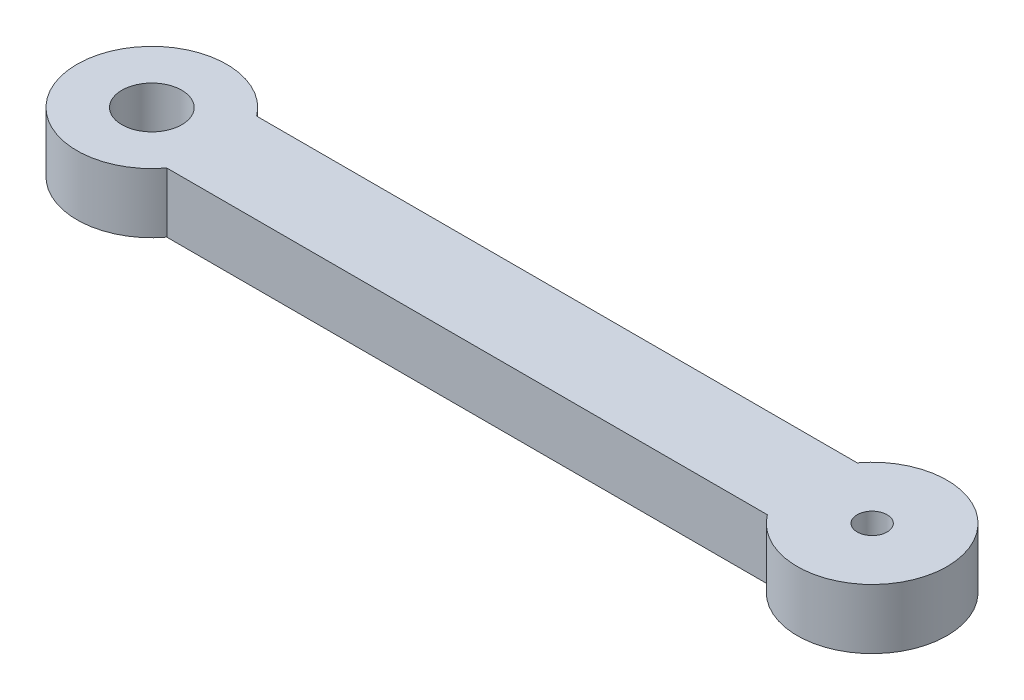
ISO-10303-21;
HEADER;
FILE_DESCRIPTION(('STEP AP214'),'2;1');
FILE_NAME('part.step','',(''),(''),'','','');
FILE_SCHEMA(('AUTOMOTIVE_DESIGN { 1 0 10303 214 1 1 1 1 }'));
ENDSEC;
DATA;
#1=APPLICATION_CONTEXT('core data for automotive mechanical design processes');
#2=APPLICATION_PROTOCOL_DEFINITION('international standard','automotive_design',2000,#1);
#3=PRODUCT_CONTEXT('',#1,'mechanical');
#4=PRODUCT('Part','Part','',(#3));
#5=PRODUCT_RELATED_PRODUCT_CATEGORY('part','',(#4));
#6=PRODUCT_DEFINITION_FORMATION('','',#4);
#7=PRODUCT_DEFINITION_CONTEXT('part definition',#1,'design');
#8=PRODUCT_DEFINITION('design','',#6,#7);
#9=PRODUCT_DEFINITION_SHAPE('','',#8);
#10=(LENGTH_UNIT() NAMED_UNIT(*) SI_UNIT(.MILLI.,.METRE.));
#11=(NAMED_UNIT(*) PLANE_ANGLE_UNIT() SI_UNIT($,.RADIAN.));
#12=(NAMED_UNIT(*) SI_UNIT($,.STERADIAN.) SOLID_ANGLE_UNIT());
#13=UNCERTAINTY_MEASURE_WITH_UNIT(LENGTH_MEASURE(1.E-05),#10,'distance_accuracy_value','');
#14=(GEOMETRIC_REPRESENTATION_CONTEXT(3) GLOBAL_UNCERTAINTY_ASSIGNED_CONTEXT((#13)) GLOBAL_UNIT_ASSIGNED_CONTEXT((#10,
#11,#12)) REPRESENTATION_CONTEXT('',''));
#15=CARTESIAN_POINT('',(0.,0.,0.));
#16=DIRECTION('',(0.,0.,1.));
#17=DIRECTION('',(1.,0.,0.));
#18=AXIS2_PLACEMENT_3D('',#15,#16,#17);
#19=CARTESIAN_POINT('',(-12.025,2.,0.));
#20=DIRECTION('',(0.,1.,0.));
#21=DIRECTION('',(0.,0.,1.));
#22=AXIS2_PLACEMENT_3D('',#19,#20,#21);
#23=PLANE('',#22);
#24=CARTESIAN_POINT('',(-12.025,2.,0.));
#25=DIRECTION('',(0.,1.,0.));
#26=DIRECTION('',(0.,0.,1.));
#27=AXIS2_PLACEMENT_3D('',#24,#25,#26);
#28=CIRCLE('',#27,1.);
#29=CARTESIAN_POINT('',(-12.025,2.,1.));
#30=VERTEX_POINT('',#29);
#31=EDGE_CURVE('E103',#30,#30,#28,.T.);
#32=ORIENTED_EDGE('',*,*,#31,.F.);
#33=EDGE_LOOP('',(#32));
#34=FACE_BOUND('',#33,.T.);
#35=CARTESIAN_POINT('',(-12.025,2.,0.));
#36=DIRECTION('',(0.,1.,0.));
#37=DIRECTION('',(0.,0.,1.));
#38=AXIS2_PLACEMENT_3D('',#35,#36,#37);
#39=CIRCLE('',#38,2.5);
#40=CARTESIAN_POINT('',(-10.025,2.,-1.5));
#41=VERTEX_POINT('',#40);
#42=CARTESIAN_POINT('',(-10.025,2.,1.5));
#43=VERTEX_POINT('',#42);
#44=EDGE_CURVE('E88',#41,#43,#39,.T.);
#45=ORIENTED_EDGE('',*,*,#44,.T.);
#46=DIRECTION('',(1.,0.,0.));
#47=VECTOR('',#46,1.);
#48=CARTESIAN_POINT('',(-10.025,2.,1.5));
#49=LINE('',#48,#47);
#50=CARTESIAN_POINT('',(10.025,2.,1.5));
#51=VERTEX_POINT('',#50);
#52=EDGE_CURVE('E83',#43,#51,#49,.T.);
#53=ORIENTED_EDGE('',*,*,#52,.T.);
#54=CARTESIAN_POINT('',(12.025,2.,0.));
#55=DIRECTION('',(0.,1.,0.));
#56=DIRECTION('',(0.,0.,1.));
#57=AXIS2_PLACEMENT_3D('',#54,#55,#56);
#58=CIRCLE('',#57,2.5);
#59=CARTESIAN_POINT('',(10.025,2.,-1.5));
#60=VERTEX_POINT('',#59);
#61=EDGE_CURVE('E86',#51,#60,#58,.T.);
#62=ORIENTED_EDGE('',*,*,#61,.T.);
#63=DIRECTION('',(-1.,0.,0.));
#64=VECTOR('',#63,1.);
#65=CARTESIAN_POINT('',(-10.025,2.,-1.5));
#66=LINE('',#65,#64);
#67=EDGE_CURVE('E53',#60,#41,#66,.T.);
#68=ORIENTED_EDGE('',*,*,#67,.T.);
#69=EDGE_LOOP('',(#45,#53,#62,#68));
#70=FACE_BOUND('',#69,.T.);
#71=CARTESIAN_POINT('',(12.025,2.,0.));
#72=DIRECTION('',(0.,1.,0.));
#73=DIRECTION('',(0.,0.,1.));
#74=AXIS2_PLACEMENT_3D('',#71,#72,#73);
#75=CIRCLE('',#74,0.500000000000001);
#76=CARTESIAN_POINT('',(12.025,2.,0.500000000000001));
#77=VERTEX_POINT('',#76);
#78=EDGE_CURVE('E118',#77,#77,#75,.T.);
#79=ORIENTED_EDGE('',*,*,#78,.F.);
#80=EDGE_LOOP('',(#79));
#81=FACE_BOUND('',#80,.T.);
#82=ADVANCED_FACE('F36',(#34,#70,#81),#23,.T.);
#83=CARTESIAN_POINT('',(-12.025,0.,0.));
#84=DIRECTION('',(0.,1.,0.));
#85=DIRECTION('',(0.,0.,1.));
#86=AXIS2_PLACEMENT_3D('',#83,#84,#85);
#87=PLANE('',#86);
#88=CARTESIAN_POINT('',(-12.025,0.,0.));
#89=DIRECTION('',(0.,1.,0.));
#90=DIRECTION('',(0.,0.,1.));
#91=AXIS2_PLACEMENT_3D('',#88,#89,#90);
#92=CIRCLE('',#91,2.5);
#93=CARTESIAN_POINT('',(-10.025,0.,-1.5));
#94=VERTEX_POINT('',#93);
#95=CARTESIAN_POINT('',(-10.025,0.,1.5));
#96=VERTEX_POINT('',#95);
#97=EDGE_CURVE('E100',#94,#96,#92,.T.);
#98=ORIENTED_EDGE('',*,*,#97,.F.);
#99=DIRECTION('',(-1.,0.,0.));
#100=VECTOR('',#99,1.);
#101=CARTESIAN_POINT('',(-10.025,0.,-1.5));
#102=LINE('',#101,#100);
#103=CARTESIAN_POINT('',(10.025,0.,-1.5));
#104=VERTEX_POINT('',#103);
#105=EDGE_CURVE('E76',#104,#94,#102,.T.);
#106=ORIENTED_EDGE('',*,*,#105,.F.);
#107=CARTESIAN_POINT('',(12.025,0.,0.));
#108=DIRECTION('',(0.,1.,0.));
#109=DIRECTION('',(0.,0.,1.));
#110=AXIS2_PLACEMENT_3D('',#107,#108,#109);
#111=CIRCLE('',#110,2.5);
#112=CARTESIAN_POINT('',(10.025,0.,1.5));
#113=VERTEX_POINT('',#112);
#114=EDGE_CURVE('E70',#113,#104,#111,.T.);
#115=ORIENTED_EDGE('',*,*,#114,.F.);
#116=DIRECTION('',(1.,0.,0.));
#117=VECTOR('',#116,1.);
#118=CARTESIAN_POINT('',(-10.025,0.,1.5));
#119=LINE('',#118,#117);
#120=EDGE_CURVE('E92',#96,#113,#119,.T.);
#121=ORIENTED_EDGE('',*,*,#120,.F.);
#122=EDGE_LOOP('',(#98,#106,#115,#121));
#123=FACE_BOUND('',#122,.T.);
#124=CARTESIAN_POINT('',(-12.025,0.,0.));
#125=DIRECTION('',(0.,1.,0.));
#126=DIRECTION('',(0.,0.,1.));
#127=AXIS2_PLACEMENT_3D('',#124,#125,#126);
#128=CIRCLE('',#127,1.);
#129=CARTESIAN_POINT('',(-12.025,0.,1.));
#130=VERTEX_POINT('',#129);
#131=EDGE_CURVE('E115',#130,#130,#128,.T.);
#132=ORIENTED_EDGE('',*,*,#131,.T.);
#133=EDGE_LOOP('',(#132));
#134=FACE_BOUND('',#133,.T.);
#135=CARTESIAN_POINT('',(12.025,0.,0.));
#136=DIRECTION('',(0.,1.,0.));
#137=DIRECTION('',(0.,0.,1.));
#138=AXIS2_PLACEMENT_3D('',#135,#136,#137);
#139=CIRCLE('',#138,0.500000000000001);
#140=CARTESIAN_POINT('',(12.025,0.,0.500000000000001));
#141=VERTEX_POINT('',#140);
#142=EDGE_CURVE('E121',#141,#141,#139,.T.);
#143=ORIENTED_EDGE('',*,*,#142,.T.);
#144=EDGE_LOOP('',(#143));
#145=FACE_BOUND('',#144,.T.);
#146=ADVANCED_FACE('F111',(#123,#134,#145),#87,.F.);
#147=CARTESIAN_POINT('',(-12.025,2.,0.));
#148=DIRECTION('',(0.,-1.,0.));
#149=DIRECTION('',(0.,0.,-1.));
#150=AXIS2_PLACEMENT_3D('',#147,#148,#149);
#151=CYLINDRICAL_SURFACE('',#150,2.5);
#152=ORIENTED_EDGE('',*,*,#97,.T.);
#153=DIRECTION('',(0.,-1.,0.));
#154=VECTOR('',#153,1.);
#155=CARTESIAN_POINT('',(-10.025,2.,1.5));
#156=LINE('',#155,#154);
#157=EDGE_CURVE('E11',#43,#96,#156,.T.);
#158=ORIENTED_EDGE('',*,*,#157,.F.);
#159=ORIENTED_EDGE('',*,*,#44,.F.);
#160=DIRECTION('',(0.,-1.,0.));
#161=VECTOR('',#160,1.);
#162=CARTESIAN_POINT('',(-10.025,2.,-1.5));
#163=LINE('',#162,#161);
#164=EDGE_CURVE('E96',#41,#94,#163,.T.);
#165=ORIENTED_EDGE('',*,*,#164,.T.);
#166=EDGE_LOOP('',(#152,#158,#159,#165));
#167=FACE_BOUND('',#166,.T.);
#168=ADVANCED_FACE('F38',(#167),#151,.T.);
#169=CARTESIAN_POINT('',(-10.025,2.,1.5));
#170=DIRECTION('',(0.,0.,-1.));
#171=DIRECTION('',(-1.,0.,0.));
#172=AXIS2_PLACEMENT_3D('',#169,#170,#171);
#173=PLANE('',#172);
#174=ORIENTED_EDGE('',*,*,#120,.T.);
#175=DIRECTION('',(0.,-1.,0.));
#176=VECTOR('',#175,1.);
#177=CARTESIAN_POINT('',(10.025,2.,1.5));
#178=LINE('',#177,#176);
#179=EDGE_CURVE('E45',#51,#113,#178,.T.);
#180=ORIENTED_EDGE('',*,*,#179,.F.);
#181=ORIENTED_EDGE('',*,*,#52,.F.);
#182=ORIENTED_EDGE('',*,*,#157,.T.);
#183=EDGE_LOOP('',(#174,#180,#181,#182));
#184=FACE_BOUND('',#183,.T.);
#185=ADVANCED_FACE('F91',(#184),#173,.F.);
#186=CARTESIAN_POINT('',(12.025,2.,0.));
#187=DIRECTION('',(0.,-1.,0.));
#188=DIRECTION('',(0.,0.,-1.));
#189=AXIS2_PLACEMENT_3D('',#186,#187,#188);
#190=CYLINDRICAL_SURFACE('',#189,2.5);
#191=ORIENTED_EDGE('',*,*,#114,.T.);
#192=DIRECTION('',(0.,-1.,0.));
#193=VECTOR('',#192,1.);
#194=CARTESIAN_POINT('',(10.025,2.,-1.5));
#195=LINE('',#194,#193);
#196=EDGE_CURVE('E93',#60,#104,#195,.T.);
#197=ORIENTED_EDGE('',*,*,#196,.F.);
#198=ORIENTED_EDGE('',*,*,#61,.F.);
#199=ORIENTED_EDGE('',*,*,#179,.T.);
#200=EDGE_LOOP('',(#191,#197,#198,#199));
#201=FACE_BOUND('',#200,.T.);
#202=ADVANCED_FACE('F94',(#201),#190,.T.);
#203=CARTESIAN_POINT('',(-10.025,2.,-1.5));
#204=DIRECTION('',(0.,0.,1.));
#205=DIRECTION('',(1.,0.,0.));
#206=AXIS2_PLACEMENT_3D('',#203,#204,#205);
#207=PLANE('',#206);
#208=ORIENTED_EDGE('',*,*,#105,.T.);
#209=ORIENTED_EDGE('',*,*,#164,.F.);
#210=ORIENTED_EDGE('',*,*,#67,.F.);
#211=ORIENTED_EDGE('',*,*,#196,.T.);
#212=EDGE_LOOP('',(#208,#209,#210,#211));
#213=FACE_BOUND('',#212,.T.);
#214=ADVANCED_FACE('F108',(#213),#207,.F.);
#215=CARTESIAN_POINT('',(-12.025,2.,0.));
#216=DIRECTION('',(0.,-1.,0.));
#217=DIRECTION('',(0.,0.,-1.));
#218=AXIS2_PLACEMENT_3D('',#215,#216,#217);
#219=CYLINDRICAL_SURFACE('',#218,1.);
#220=ORIENTED_EDGE('',*,*,#31,.T.);
#221=EDGE_LOOP('',(#220));
#222=FACE_BOUND('',#221,.T.);
#223=ORIENTED_EDGE('',*,*,#131,.F.);
#224=EDGE_LOOP('',(#223));
#225=FACE_BOUND('',#224,.T.);
#226=ADVANCED_FACE('F138',(#222,#225),#219,.F.);
#227=CARTESIAN_POINT('',(12.025,2.,0.));
#228=DIRECTION('',(0.,-1.,0.));
#229=DIRECTION('',(0.,0.,-1.));
#230=AXIS2_PLACEMENT_3D('',#227,#228,#229);
#231=CYLINDRICAL_SURFACE('',#230,0.500000000000001);
#232=ORIENTED_EDGE('',*,*,#78,.T.);
#233=EDGE_LOOP('',(#232));
#234=FACE_BOUND('',#233,.T.);
#235=ORIENTED_EDGE('',*,*,#142,.F.);
#236=EDGE_LOOP('',(#235));
#237=FACE_BOUND('',#236,.T.);
#238=ADVANCED_FACE('F127',(#234,#237),#231,.F.);
#239=CLOSED_SHELL('',(#82,#146,#168,#185,#202,#214,#226,#238));
#240=MANIFOLD_SOLID_BREP('B2',#239);
#241=ADVANCED_BREP_SHAPE_REPRESENTATION('',(#18,#240),#14);
#242=SHAPE_DEFINITION_REPRESENTATION(#9,#241);
ENDSEC;
END-ISO-10303-21;
